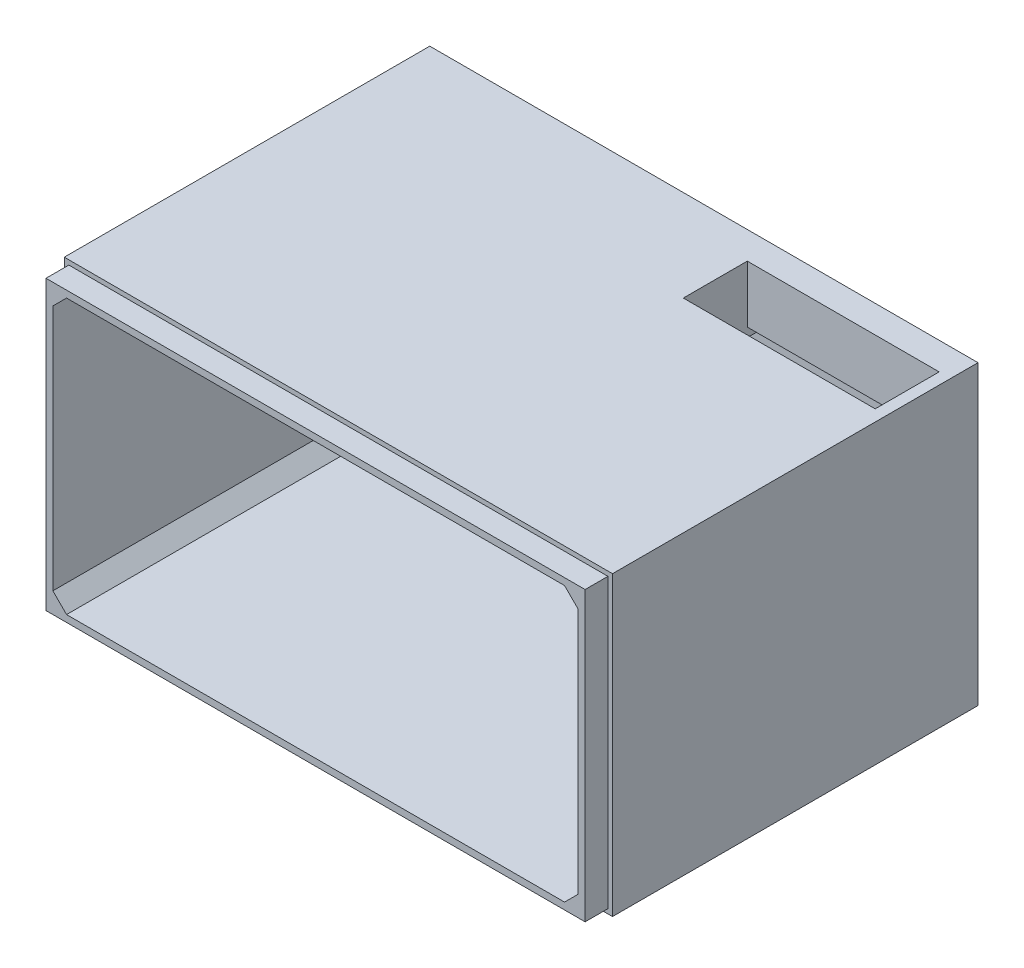
ISO-10303-21;
HEADER;
FILE_DESCRIPTION(('STEP AP214'),'2;1');
FILE_NAME('part.step','',(''),(''),'','','');
FILE_SCHEMA(('AUTOMOTIVE_DESIGN { 1 0 10303 214 1 1 1 1 }'));
ENDSEC;
DATA;
#1=APPLICATION_CONTEXT('core data for automotive mechanical design processes');
#2=APPLICATION_PROTOCOL_DEFINITION('international standard','automotive_design',2000,#1);
#3=PRODUCT_CONTEXT('',#1,'mechanical');
#4=PRODUCT('Part','Part','',(#3));
#5=PRODUCT_RELATED_PRODUCT_CATEGORY('part','',(#4));
#6=PRODUCT_DEFINITION_FORMATION('','',#4);
#7=PRODUCT_DEFINITION_CONTEXT('part definition',#1,'design');
#8=PRODUCT_DEFINITION('design','',#6,#7);
#9=PRODUCT_DEFINITION_SHAPE('','',#8);
#10=(LENGTH_UNIT() NAMED_UNIT(*) SI_UNIT(.MILLI.,.METRE.));
#11=(NAMED_UNIT(*) PLANE_ANGLE_UNIT() SI_UNIT($,.RADIAN.));
#12=(NAMED_UNIT(*) SI_UNIT($,.STERADIAN.) SOLID_ANGLE_UNIT());
#13=UNCERTAINTY_MEASURE_WITH_UNIT(LENGTH_MEASURE(1.E-05),#10,'distance_accuracy_value','');
#14=(GEOMETRIC_REPRESENTATION_CONTEXT(3) GLOBAL_UNCERTAINTY_ASSIGNED_CONTEXT((#13)) GLOBAL_UNIT_ASSIGNED_CONTEXT((#10,
#11,#12)) REPRESENTATION_CONTEXT('',''));
#15=CARTESIAN_POINT('',(0.,0.,0.));
#16=DIRECTION('',(0.,0.,1.));
#17=DIRECTION('',(1.,0.,0.));
#18=AXIS2_PLACEMENT_3D('',#15,#16,#17);
#19=CARTESIAN_POINT('',(73.5,50.5,14.));
#20=DIRECTION('',(0.,0.,1.));
#21=DIRECTION('',(1.,0.,0.));
#22=AXIS2_PLACEMENT_3D('',#19,#20,#21);
#23=PLANE('',#22);
#24=DIRECTION('',(1.,0.,0.));
#25=VECTOR('',#24,1.);
#26=CARTESIAN_POINT('',(73.5,50.5,14.));
#27=LINE('',#26,#25);
#28=CARTESIAN_POINT('',(115.112593264333,50.5,14.));
#29=VERTEX_POINT('',#28);
#30=CARTESIAN_POINT('',(117.5,50.5,14.));
#31=VERTEX_POINT('',#30);
#32=EDGE_CURVE('E248',#29,#31,#27,.T.);
#33=ORIENTED_EDGE('',*,*,#32,.F.);
#34=DIRECTION('',(0.,1.,0.));
#35=VECTOR('',#34,1.);
#36=CARTESIAN_POINT('',(115.112593264333,47.5,14.));
#37=LINE('',#36,#35);
#38=CARTESIAN_POINT('',(115.112593264333,52.5,14.));
#39=VERTEX_POINT('',#38);
#40=EDGE_CURVE('E233',#29,#39,#37,.T.);
#41=ORIENTED_EDGE('',*,*,#40,.T.);
#42=DIRECTION('',(1.,0.,0.));
#43=VECTOR('',#42,1.);
#44=CARTESIAN_POINT('',(73.5,52.5,14.));
#45=LINE('',#44,#43);
#46=CARTESIAN_POINT('',(117.5,52.5,14.));
#47=VERTEX_POINT('',#46);
#48=EDGE_CURVE('E246',#39,#47,#45,.T.);
#49=ORIENTED_EDGE('',*,*,#48,.T.);
#50=DIRECTION('',(0.,-1.,0.));
#51=VECTOR('',#50,1.);
#52=CARTESIAN_POINT('',(117.5,62.5,14.));
#53=LINE('',#52,#51);
#54=EDGE_CURVE('E268',#47,#31,#53,.T.);
#55=ORIENTED_EDGE('',*,*,#54,.T.);
#56=EDGE_LOOP('',(#33,#41,#49,#55));
#57=FACE_BOUND('',#56,.T.);
#58=ADVANCED_FACE('F32',(#57),#23,.F.);
#59=CARTESIAN_POINT('',(75.5,52.5,2.00000000000001));
#60=DIRECTION('',(0.,-1.,0.));
#61=DIRECTION('',(0.,0.,-1.));
#62=AXIS2_PLACEMENT_3D('',#59,#60,#61);
#63=PLANE('',#62);
#64=DIRECTION('',(1.,0.,0.));
#65=VECTOR('',#64,1.);
#66=CARTESIAN_POINT('',(75.5,52.5,6.00000000000002));
#67=LINE('',#66,#65);
#68=CARTESIAN_POINT('',(75.5,52.5,6.00000000000002));
#69=VERTEX_POINT('',#68);
#70=CARTESIAN_POINT('',(117.5,52.5,6.00000000000002));
#71=VERTEX_POINT('',#70);
#72=EDGE_CURVE('E285',#69,#71,#67,.T.);
#73=ORIENTED_EDGE('',*,*,#72,.F.);
#74=DIRECTION('',(0.,0.,-1.));
#75=VECTOR('',#74,1.);
#76=CARTESIAN_POINT('',(75.5,52.5,15.));
#77=LINE('',#76,#75);
#78=CARTESIAN_POINT('',(75.5,52.5,3.00000000000002));
#79=VERTEX_POINT('',#78);
#80=EDGE_CURVE('E448',#69,#79,#77,.T.);
#81=ORIENTED_EDGE('',*,*,#80,.T.);
#82=DIRECTION('',(1.,0.,0.));
#83=VECTOR('',#82,1.);
#84=CARTESIAN_POINT('',(0.,52.5,3.00000000000002));
#85=LINE('',#84,#83);
#86=CARTESIAN_POINT('',(117.5,52.5,3.00000000000002));
#87=VERTEX_POINT('',#86);
#88=EDGE_CURVE('E427',#79,#87,#85,.T.);
#89=ORIENTED_EDGE('',*,*,#88,.T.);
#90=DIRECTION('',(0.,0.,-1.));
#91=VECTOR('',#90,1.);
#92=CARTESIAN_POINT('',(117.5,52.5,3.00000000000002));
#93=LINE('',#92,#91);
#94=EDGE_CURVE('E288',#71,#87,#93,.T.);
#95=ORIENTED_EDGE('',*,*,#94,.F.);
#96=EDGE_LOOP('',(#73,#81,#89,#95));
#97=FACE_BOUND('',#96,.T.);
#98=ADVANCED_FACE('F496',(#97),#63,.T.);
#99=CARTESIAN_POINT('',(0.,0.,3.00000000000002));
#100=DIRECTION('',(0.,0.,1.));
#101=DIRECTION('',(1.,0.,0.));
#102=AXIS2_PLACEMENT_3D('',#99,#100,#101);
#103=PLANE('',#102);
#104=DIRECTION('',(1.,0.,0.));
#105=VECTOR('',#104,1.);
#106=CARTESIAN_POINT('',(73.5,50.5,3.00000000000002));
#107=LINE('',#106,#105);
#108=CARTESIAN_POINT('',(73.5,50.5,3.00000000000002));
#109=VERTEX_POINT('',#108);
#110=CARTESIAN_POINT('',(75.5,50.5,3.00000000000002));
#111=VERTEX_POINT('',#110);
#112=EDGE_CURVE('E453',#109,#111,#107,.T.);
#113=ORIENTED_EDGE('',*,*,#112,.F.);
#114=DIRECTION('',(0.,-1.,0.));
#115=VECTOR('',#114,1.);
#116=CARTESIAN_POINT('',(73.5,52.5,3.00000000000002));
#117=LINE('',#116,#115);
#118=CARTESIAN_POINT('',(73.4999999999999,62.5,3.00000000000002));
#119=VERTEX_POINT('',#118);
#120=EDGE_CURVE('E55',#119,#109,#117,.T.);
#121=ORIENTED_EDGE('',*,*,#120,.F.);
#122=DIRECTION('',(-1.,0.,0.));
#123=VECTOR('',#122,1.);
#124=CARTESIAN_POINT('',(2.49999999999997,62.5,3.00000000000002));
#125=LINE('',#124,#123);
#126=CARTESIAN_POINT('',(5.49999999999997,62.5,3.00000000000002));
#127=VERTEX_POINT('',#126);
#128=EDGE_CURVE('E389',#119,#127,#125,.T.);
#129=ORIENTED_EDGE('',*,*,#128,.T.);
#130=DIRECTION('',(0.707106781186547,0.707106781186548,0.));
#131=VECTOR('',#130,1.);
#132=CARTESIAN_POINT('',(-28.5,28.5,3.00000000000002));
#133=LINE('',#132,#131);
#134=CARTESIAN_POINT('',(2.49999999999997,59.5,3.00000000000002));
#135=VERTEX_POINT('',#134);
#136=EDGE_CURVE('E418',#135,#127,#133,.T.);
#137=ORIENTED_EDGE('',*,*,#136,.F.);
#138=DIRECTION('',(0.,-1.,0.));
#139=VECTOR('',#138,1.);
#140=CARTESIAN_POINT('',(2.49999999999997,62.5,3.00000000000002));
#141=LINE('',#140,#139);
#142=CARTESIAN_POINT('',(2.49999999999997,5.5,3.00000000000002));
#143=VERTEX_POINT('',#142);
#144=EDGE_CURVE('E381',#135,#143,#141,.T.);
#145=ORIENTED_EDGE('',*,*,#144,.T.);
#146=DIRECTION('',(-0.707106781186549,0.707106781186547,0.));
#147=VECTOR('',#146,1.);
#148=CARTESIAN_POINT('',(3.99999999999998,3.99999999999999,3.00000000000002));
#149=LINE('',#148,#147);
#150=CARTESIAN_POINT('',(5.49999999999998,2.5,3.00000000000002));
#151=VERTEX_POINT('',#150);
#152=EDGE_CURVE('E424',#151,#143,#149,.T.);
#153=ORIENTED_EDGE('',*,*,#152,.F.);
#154=DIRECTION('',(1.,0.,0.));
#155=VECTOR('',#154,1.);
#156=CARTESIAN_POINT('',(2.49999999999998,2.5,3.00000000000002));
#157=LINE('',#156,#155);
#158=CARTESIAN_POINT('',(114.5,2.5,3.00000000000002));
#159=VERTEX_POINT('',#158);
#160=EDGE_CURVE('E383',#151,#159,#157,.T.);
#161=ORIENTED_EDGE('',*,*,#160,.T.);
#162=DIRECTION('',(-0.707106781186548,-0.707106781186547,0.));
#163=VECTOR('',#162,1.);
#164=CARTESIAN_POINT('',(55.9999999999999,-56.,3.00000000000002));
#165=LINE('',#164,#163);
#166=CARTESIAN_POINT('',(117.5,5.5,3.00000000000002));
#167=VERTEX_POINT('',#166);
#168=EDGE_CURVE('E421',#167,#159,#165,.T.);
#169=ORIENTED_EDGE('',*,*,#168,.F.);
#170=DIRECTION('',(0.,1.,0.));
#171=VECTOR('',#170,1.);
#172=CARTESIAN_POINT('',(117.5,62.5,3.00000000000002));
#173=LINE('',#172,#171);
#174=EDGE_CURVE('E386',#167,#87,#173,.T.);
#175=ORIENTED_EDGE('',*,*,#174,.T.);
#176=ORIENTED_EDGE('',*,*,#88,.F.);
#177=DIRECTION('',(0.,1.,0.));
#178=VECTOR('',#177,1.);
#179=CARTESIAN_POINT('',(75.5,52.5,3.00000000000002));
#180=LINE('',#179,#178);
#181=EDGE_CURVE('E450',#111,#79,#180,.T.);
#182=ORIENTED_EDGE('',*,*,#181,.F.);
#183=EDGE_LOOP('',(#113,#121,#129,#137,#145,#153,#161,#169,#175,#176,#182));
#184=FACE_BOUND('',#183,.T.);
#185=ADVANCED_FACE('F500',(#184),#103,.T.);
#186=CARTESIAN_POINT('',(75.5,52.5,14.));
#187=VERTEX_POINT('',#186);
#188=CARTESIAN_POINT('',(98.1125932643334,52.5,14.));
#189=VERTEX_POINT('',#188);
#190=EDGE_CURVE('E255',#187,#189,#45,.T.);
#191=ORIENTED_EDGE('',*,*,#190,.T.);
#192=DIRECTION('',(0.,1.,0.));
#193=VECTOR('',#192,1.);
#194=CARTESIAN_POINT('',(98.1125932643334,47.5,14.));
#195=LINE('',#194,#193);
#196=CARTESIAN_POINT('',(98.1125932643334,50.5,14.));
#197=VERTEX_POINT('',#196);
#198=EDGE_CURVE('E47',#197,#189,#195,.T.);
#199=ORIENTED_EDGE('',*,*,#198,.F.);
#200=CARTESIAN_POINT('',(75.5,50.5,14.));
#201=VERTEX_POINT('',#200);
#202=EDGE_CURVE('E440',#201,#197,#27,.T.);
#203=ORIENTED_EDGE('',*,*,#202,.F.);
#204=DIRECTION('',(0.,-1.,0.));
#205=VECTOR('',#204,1.);
#206=CARTESIAN_POINT('',(75.5,50.5,14.));
#207=LINE('',#206,#205);
#208=EDGE_CURVE('E256',#187,#201,#207,.T.);
#209=ORIENTED_EDGE('',*,*,#208,.F.);
#210=EDGE_LOOP('',(#191,#199,#203,#209));
#211=FACE_BOUND('',#210,.T.);
#212=ADVANCED_FACE('F474',(#211),#23,.F.);
#213=CARTESIAN_POINT('',(117.5,62.5,3.00000000000002));
#214=DIRECTION('',(1.,0.,0.));
#215=DIRECTION('',(0.,1.,0.));
#216=AXIS2_PLACEMENT_3D('',#213,#214,#215);
#217=PLANE('',#216);
#218=DIRECTION('',(0.,-1.,0.));
#219=VECTOR('',#218,1.);
#220=CARTESIAN_POINT('',(117.5,62.5,22.));
#221=LINE('',#220,#219);
#222=CARTESIAN_POINT('',(117.5,59.5,22.));
#223=VERTEX_POINT('',#222);
#224=CARTESIAN_POINT('',(117.5,50.5,22.));
#225=VERTEX_POINT('',#224);
#226=EDGE_CURVE('E40',#223,#225,#221,.T.);
#227=ORIENTED_EDGE('',*,*,#226,.T.);
#228=DIRECTION('',(0.,0.,-1.));
#229=VECTOR('',#228,1.);
#230=CARTESIAN_POINT('',(117.5,50.5,3.00000000000002));
#231=LINE('',#230,#229);
#232=EDGE_CURVE('E11',#225,#31,#231,.T.);
#233=ORIENTED_EDGE('',*,*,#232,.T.);
#234=ORIENTED_EDGE('',*,*,#54,.F.);
#235=DIRECTION('',(0.,0.,-1.));
#236=VECTOR('',#235,1.);
#237=CARTESIAN_POINT('',(117.5,52.5,3.00000000000002));
#238=LINE('',#237,#236);
#239=CARTESIAN_POINT('',(117.5,52.5,20.));
#240=VERTEX_POINT('',#239);
#241=EDGE_CURVE('E253',#240,#47,#238,.T.);
#242=ORIENTED_EDGE('',*,*,#241,.F.);
#243=DIRECTION('',(0.,1.,0.));
#244=VECTOR('',#243,1.);
#245=CARTESIAN_POINT('',(117.5,55.,20.));
#246=LINE('',#245,#244);
#247=CARTESIAN_POINT('',(117.5,65.,20.));
#248=VERTEX_POINT('',#247);
#249=EDGE_CURVE('E304',#240,#248,#246,.T.);
#250=ORIENTED_EDGE('',*,*,#249,.T.);
#251=DIRECTION('',(0.,0.,-1.));
#252=VECTOR('',#251,1.);
#253=CARTESIAN_POINT('',(117.5,65.,20.));
#254=LINE('',#253,#252);
#255=CARTESIAN_POINT('',(117.5,65.,6.));
#256=VERTEX_POINT('',#255);
#257=EDGE_CURVE('E291',#248,#256,#254,.T.);
#258=ORIENTED_EDGE('',*,*,#257,.T.);
#259=DIRECTION('',(0.,1.,0.));
#260=VECTOR('',#259,1.);
#261=CARTESIAN_POINT('',(117.5,55.,6.));
#262=LINE('',#261,#260);
#263=EDGE_CURVE('E303',#71,#256,#262,.T.);
#264=ORIENTED_EDGE('',*,*,#263,.F.);
#265=ORIENTED_EDGE('',*,*,#94,.T.);
#266=ORIENTED_EDGE('',*,*,#174,.F.);
#267=DIRECTION('',(0.,0.,1.));
#268=VECTOR('',#267,1.);
#269=CARTESIAN_POINT('',(117.5,5.5,0.));
#270=LINE('',#269,#268);
#271=CARTESIAN_POINT('',(117.5,5.5,85.));
#272=VERTEX_POINT('',#271);
#273=EDGE_CURVE('E338',#167,#272,#270,.T.);
#274=ORIENTED_EDGE('',*,*,#273,.T.);
#275=DIRECTION('',(0.,1.,0.));
#276=VECTOR('',#275,1.);
#277=CARTESIAN_POINT('',(117.5,62.5,85.));
#278=LINE('',#277,#276);
#279=CARTESIAN_POINT('',(117.5,59.5,85.));
#280=VERTEX_POINT('',#279);
#281=EDGE_CURVE('E395',#272,#280,#278,.T.);
#282=ORIENTED_EDGE('',*,*,#281,.T.);
#283=DIRECTION('',(0.,0.,1.));
#284=VECTOR('',#283,1.);
#285=CARTESIAN_POINT('',(117.5,59.5,0.));
#286=LINE('',#285,#284);
#287=EDGE_CURVE('E346',#223,#280,#286,.T.);
#288=ORIENTED_EDGE('',*,*,#287,.F.);
#289=EDGE_LOOP('',(#227,#233,#234,#242,#250,#258,#264,#265,#266,#274,#282,#288));
#290=FACE_BOUND('',#289,.T.);
#291=ADVANCED_FACE('F432',(#290),#217,.F.);
#292=CARTESIAN_POINT('',(2.49999999999997,62.5,3.00000000000002));
#293=DIRECTION('',(0.,1.,0.));
#294=DIRECTION('',(0.,0.,1.));
#295=AXIS2_PLACEMENT_3D('',#292,#293,#294);
#296=PLANE('',#295);
#297=DIRECTION('',(0.,0.,-1.));
#298=VECTOR('',#297,1.);
#299=CARTESIAN_POINT('',(73.5,62.5,20.));
#300=LINE('',#299,#298);
#301=CARTESIAN_POINT('',(73.5,62.5,22.));
#302=VERTEX_POINT('',#301);
#303=EDGE_CURVE('E283',#302,#119,#300,.T.);
#304=ORIENTED_EDGE('',*,*,#303,.F.);
#305=DIRECTION('',(-1.,0.,0.));
#306=VECTOR('',#305,1.);
#307=CARTESIAN_POINT('',(73.5,62.5,22.));
#308=LINE('',#307,#306);
#309=CARTESIAN_POINT('',(114.5,62.5,22.));
#310=VERTEX_POINT('',#309);
#311=EDGE_CURVE('E273',#310,#302,#308,.T.);
#312=ORIENTED_EDGE('',*,*,#311,.F.);
#313=DIRECTION('',(0.,0.,1.));
#314=VECTOR('',#313,1.);
#315=CARTESIAN_POINT('',(114.5,62.5,0.));
#316=LINE('',#315,#314);
#317=CARTESIAN_POINT('',(114.5,62.5,85.));
#318=VERTEX_POINT('',#317);
#319=EDGE_CURVE('E345',#310,#318,#316,.T.);
#320=ORIENTED_EDGE('',*,*,#319,.T.);
#321=DIRECTION('',(-1.,0.,0.));
#322=VECTOR('',#321,1.);
#323=CARTESIAN_POINT('',(2.49999999999997,62.5,85.));
#324=LINE('',#323,#322);
#325=CARTESIAN_POINT('',(5.49999999999997,62.5,85.));
#326=VERTEX_POINT('',#325);
#327=EDGE_CURVE('E384',#318,#326,#324,.T.);
#328=ORIENTED_EDGE('',*,*,#327,.T.);
#329=DIRECTION('',(0.,0.,1.));
#330=VECTOR('',#329,1.);
#331=CARTESIAN_POINT('',(5.49999999999997,62.5,0.));
#332=LINE('',#331,#330);
#333=EDGE_CURVE('E353',#127,#326,#332,.T.);
#334=ORIENTED_EDGE('',*,*,#333,.F.);
#335=ORIENTED_EDGE('',*,*,#128,.F.);
#336=EDGE_LOOP('',(#304,#312,#320,#328,#334,#335));
#337=FACE_BOUND('',#336,.T.);
#338=ADVANCED_FACE('F521',(#337),#296,.F.);
#339=CARTESIAN_POINT('',(114.5,62.5,0.));
#340=DIRECTION('',(-0.707106781186548,-0.707106781186548,0.));
#341=DIRECTION('',(0.707106781186548,-0.707106781186548,0.));
#342=AXIS2_PLACEMENT_3D('',#339,#340,#341);
#343=PLANE('',#342);
#344=DIRECTION('',(-0.707106781186548,0.707106781186548,0.));
#345=VECTOR('',#344,1.);
#346=CARTESIAN_POINT('',(114.5,62.5,22.));
#347=LINE('',#346,#345);
#348=EDGE_CURVE('E276',#223,#310,#347,.T.);
#349=ORIENTED_EDGE('',*,*,#348,.F.);
#350=ORIENTED_EDGE('',*,*,#287,.T.);
#351=DIRECTION('',(0.707106781186547,-0.707106781186547,0.));
#352=VECTOR('',#351,1.);
#353=CARTESIAN_POINT('',(114.5,62.5,85.));
#354=LINE('',#353,#352);
#355=EDGE_CURVE('E340',#318,#280,#354,.T.);
#356=ORIENTED_EDGE('',*,*,#355,.F.);
#357=ORIENTED_EDGE('',*,*,#319,.F.);
#358=EDGE_LOOP('',(#349,#350,#356,#357));
#359=FACE_BOUND('',#358,.T.);
#360=ADVANCED_FACE('F517',(#359),#343,.T.);
#361=CARTESIAN_POINT('',(0.,0.,85.));
#362=DIRECTION('',(0.,0.,-1.));
#363=DIRECTION('',(-1.,0.,0.));
#364=AXIS2_PLACEMENT_3D('',#361,#362,#363);
#365=PLANE('',#364);
#366=ORIENTED_EDGE('',*,*,#281,.F.);
#367=DIRECTION('',(-0.707106781186548,-0.707106781186547,0.));
#368=VECTOR('',#367,1.);
#369=CARTESIAN_POINT('',(114.5,2.5,85.));
#370=LINE('',#369,#368);
#371=CARTESIAN_POINT('',(114.5,2.5,85.));
#372=VERTEX_POINT('',#371);
#373=EDGE_CURVE('E333',#272,#372,#370,.T.);
#374=ORIENTED_EDGE('',*,*,#373,.T.);
#375=DIRECTION('',(1.,0.,0.));
#376=VECTOR('',#375,1.);
#377=CARTESIAN_POINT('',(2.49999999999998,2.5,85.));
#378=LINE('',#377,#376);
#379=CARTESIAN_POINT('',(5.49999999999998,2.5,85.));
#380=VERTEX_POINT('',#379);
#381=EDGE_CURVE('E393',#380,#372,#378,.T.);
#382=ORIENTED_EDGE('',*,*,#381,.F.);
#383=DIRECTION('',(-0.707106781186548,0.707106781186546,0.));
#384=VECTOR('',#383,1.);
#385=CARTESIAN_POINT('',(2.49999999999997,5.5,85.));
#386=LINE('',#385,#384);
#387=CARTESIAN_POINT('',(2.49999999999998,5.5,85.));
#388=VERTEX_POINT('',#387);
#389=EDGE_CURVE('E326',#380,#388,#386,.T.);
#390=ORIENTED_EDGE('',*,*,#389,.T.);
#391=DIRECTION('',(0.,-1.,0.));
#392=VECTOR('',#391,1.);
#393=CARTESIAN_POINT('',(2.49999999999997,62.5,85.));
#394=LINE('',#393,#392);
#395=CARTESIAN_POINT('',(2.49999999999997,59.5,85.));
#396=VERTEX_POINT('',#395);
#397=EDGE_CURVE('E379',#396,#388,#394,.T.);
#398=ORIENTED_EDGE('',*,*,#397,.F.);
#399=DIRECTION('',(0.707106781186547,0.707106781186548,0.));
#400=VECTOR('',#399,1.);
#401=CARTESIAN_POINT('',(2.49999999999997,59.5,85.));
#402=LINE('',#401,#400);
#403=EDGE_CURVE('E348',#396,#326,#402,.T.);
#404=ORIENTED_EDGE('',*,*,#403,.T.);
#405=ORIENTED_EDGE('',*,*,#327,.F.);
#406=ORIENTED_EDGE('',*,*,#355,.T.);
#407=EDGE_LOOP('',(#366,#374,#382,#390,#398,#404,#405,#406));
#408=FACE_BOUND('',#407,.T.);
#409=DIRECTION('',(-1.,0.,0.));
#410=VECTOR('',#409,1.);
#411=CARTESIAN_POINT('',(119.,1.,85.));
#412=LINE('',#411,#410);
#413=CARTESIAN_POINT('',(119.,1.,85.));
#414=VERTEX_POINT('',#413);
#415=CARTESIAN_POINT('',(0.999999999999986,1.,85.));
#416=VERTEX_POINT('',#415);
#417=EDGE_CURVE('E313',#414,#416,#412,.T.);
#418=ORIENTED_EDGE('',*,*,#417,.F.);
#419=DIRECTION('',(0.,-1.,0.));
#420=VECTOR('',#419,1.);
#421=CARTESIAN_POINT('',(119.,64.,85.));
#422=LINE('',#421,#420);
#423=CARTESIAN_POINT('',(119.,64.,85.));
#424=VERTEX_POINT('',#423);
#425=EDGE_CURVE('E319',#424,#414,#422,.T.);
#426=ORIENTED_EDGE('',*,*,#425,.F.);
#427=DIRECTION('',(1.,0.,0.));
#428=VECTOR('',#427,1.);
#429=CARTESIAN_POINT('',(0.999999999999972,64.,85.));
#430=LINE('',#429,#428);
#431=CARTESIAN_POINT('',(0.999999999999972,64.,85.));
#432=VERTEX_POINT('',#431);
#433=EDGE_CURVE('E360',#432,#424,#430,.T.);
#434=ORIENTED_EDGE('',*,*,#433,.F.);
#435=DIRECTION('',(0.,1.,0.));
#436=VECTOR('',#435,1.);
#437=CARTESIAN_POINT('',(0.999999999999972,65.,85.));
#438=LINE('',#437,#436);
#439=EDGE_CURVE('E369',#416,#432,#438,.T.);
#440=ORIENTED_EDGE('',*,*,#439,.F.);
#441=EDGE_LOOP('',(#418,#426,#434,#440));
#442=FACE_BOUND('',#441,.T.);
#443=ADVANCED_FACE('F510',(#408,#442),#365,.F.);
#444=CARTESIAN_POINT('',(1.,0.,0.));
#445=DIRECTION('',(1.,0.,0.));
#446=DIRECTION('',(0.,1.,0.));
#447=AXIS2_PLACEMENT_3D('',#444,#445,#446);
#448=PLANE('',#447);
#449=DIRECTION('',(0.,0.,-1.));
#450=VECTOR('',#449,1.);
#451=CARTESIAN_POINT('',(0.999999999999986,1.,80.));
#452=LINE('',#451,#450);
#453=CARTESIAN_POINT('',(0.999999999999986,1.,80.));
#454=VERTEX_POINT('',#453);
#455=EDGE_CURVE('E315',#416,#454,#452,.T.);
#456=ORIENTED_EDGE('',*,*,#455,.F.);
#457=ORIENTED_EDGE('',*,*,#439,.T.);
#458=DIRECTION('',(0.,0.,1.));
#459=VECTOR('',#458,1.);
#460=CARTESIAN_POINT('',(0.999999999999972,64.,85.));
#461=LINE('',#460,#459);
#462=CARTESIAN_POINT('',(0.999999999999973,64.,80.));
#463=VERTEX_POINT('',#462);
#464=EDGE_CURVE('E356',#463,#432,#461,.T.);
#465=ORIENTED_EDGE('',*,*,#464,.F.);
#466=DIRECTION('',(0.,-1.,0.));
#467=VECTOR('',#466,1.);
#468=CARTESIAN_POINT('',(0.999999999999972,65.,80.));
#469=LINE('',#468,#467);
#470=EDGE_CURVE('E371',#463,#454,#469,.T.);
#471=ORIENTED_EDGE('',*,*,#470,.T.);
#472=EDGE_LOOP('',(#456,#457,#465,#471));
#473=FACE_BOUND('',#472,.T.);
#474=ADVANCED_FACE('F580',(#473),#448,.F.);
#475=CARTESIAN_POINT('',(119.,0.,0.));
#476=DIRECTION('',(1.,0.,0.));
#477=DIRECTION('',(0.,1.,0.));
#478=AXIS2_PLACEMENT_3D('',#475,#476,#477);
#479=PLANE('',#478);
#480=ORIENTED_EDGE('',*,*,#425,.T.);
#481=DIRECTION('',(0.,0.,1.));
#482=VECTOR('',#481,1.);
#483=CARTESIAN_POINT('',(119.,1.,80.));
#484=LINE('',#483,#482);
#485=CARTESIAN_POINT('',(119.,1.,80.));
#486=VERTEX_POINT('',#485);
#487=EDGE_CURVE('E306',#486,#414,#484,.T.);
#488=ORIENTED_EDGE('',*,*,#487,.F.);
#489=DIRECTION('',(0.,1.,0.));
#490=VECTOR('',#489,1.);
#491=CARTESIAN_POINT('',(119.,64.,80.));
#492=LINE('',#491,#490);
#493=CARTESIAN_POINT('',(119.,64.,80.));
#494=VERTEX_POINT('',#493);
#495=EDGE_CURVE('E322',#486,#494,#492,.T.);
#496=ORIENTED_EDGE('',*,*,#495,.T.);
#497=DIRECTION('',(0.,0.,1.));
#498=VECTOR('',#497,1.);
#499=CARTESIAN_POINT('',(119.,64.,85.));
#500=LINE('',#499,#498);
#501=EDGE_CURVE('E324',#494,#424,#500,.T.);
#502=ORIENTED_EDGE('',*,*,#501,.T.);
#503=EDGE_LOOP('',(#480,#488,#496,#502));
#504=FACE_BOUND('',#503,.T.);
#505=ADVANCED_FACE('F589',(#504),#479,.T.);
#506=CARTESIAN_POINT('',(0.,64.,0.));
#507=DIRECTION('',(0.,-1.,0.));
#508=DIRECTION('',(0.,0.,-1.));
#509=AXIS2_PLACEMENT_3D('',#506,#507,#508);
#510=PLANE('',#509);
#511=ORIENTED_EDGE('',*,*,#501,.F.);
#512=DIRECTION('',(-1.,0.,0.));
#513=VECTOR('',#512,1.);
#514=CARTESIAN_POINT('',(0.999999999999972,64.,80.));
#515=LINE('',#514,#513);
#516=EDGE_CURVE('E363',#494,#463,#515,.T.);
#517=ORIENTED_EDGE('',*,*,#516,.T.);
#518=ORIENTED_EDGE('',*,*,#464,.T.);
#519=ORIENTED_EDGE('',*,*,#433,.T.);
#520=EDGE_LOOP('',(#511,#517,#518,#519));
#521=FACE_BOUND('',#520,.T.);
#522=ADVANCED_FACE('F587',(#521),#510,.F.);
#523=CARTESIAN_POINT('',(0.,0.,85.));
#524=DIRECTION('',(1.,0.,0.));
#525=DIRECTION('',(0.,1.,0.));
#526=AXIS2_PLACEMENT_3D('',#523,#524,#525);
#527=PLANE('',#526);
#528=DIRECTION('',(0.,0.,-1.));
#529=VECTOR('',#528,1.);
#530=CARTESIAN_POINT('',(0.,0.,85.));
#531=LINE('',#530,#529);
#532=CARTESIAN_POINT('',(0.,0.,80.));
#533=VERTEX_POINT('',#532);
#534=CARTESIAN_POINT('',(0.,0.,0.));
#535=VERTEX_POINT('',#534);
#536=EDGE_CURVE('E416',#533,#535,#531,.T.);
#537=ORIENTED_EDGE('',*,*,#536,.F.);
#538=DIRECTION('',(0.,-1.,0.));
#539=VECTOR('',#538,1.);
#540=CARTESIAN_POINT('',(0.,65.,80.));
#541=LINE('',#540,#539);
#542=CARTESIAN_POINT('',(0.,65.,80.));
#543=VERTEX_POINT('',#542);
#544=EDGE_CURVE('E368',#543,#533,#541,.T.);
#545=ORIENTED_EDGE('',*,*,#544,.F.);
#546=DIRECTION('',(0.,0.,-1.));
#547=VECTOR('',#546,1.);
#548=CARTESIAN_POINT('',(0.,65.,85.));
#549=LINE('',#548,#547);
#550=CARTESIAN_POINT('',(0.,65.,0.));
#551=VERTEX_POINT('',#550);
#552=EDGE_CURVE('E410',#543,#551,#549,.T.);
#553=ORIENTED_EDGE('',*,*,#552,.T.);
#554=DIRECTION('',(0.,-1.,0.));
#555=VECTOR('',#554,1.);
#556=CARTESIAN_POINT('',(0.,0.,0.));
#557=LINE('',#556,#555);
#558=EDGE_CURVE('E391',#551,#535,#557,.T.);
#559=ORIENTED_EDGE('',*,*,#558,.T.);
#560=EDGE_LOOP('',(#537,#545,#553,#559));
#561=FACE_BOUND('',#560,.T.);
#562=ADVANCED_FACE('F34',(#561),#527,.F.);
#563=CARTESIAN_POINT('',(0.,0.,85.));
#564=DIRECTION('',(0.,1.,0.));
#565=DIRECTION('',(0.,0.,1.));
#566=AXIS2_PLACEMENT_3D('',#563,#564,#565);
#567=PLANE('',#566);
#568=DIRECTION('',(0.,0.,-1.));
#569=VECTOR('',#568,1.);
#570=CARTESIAN_POINT('',(120.,0.,85.));
#571=LINE('',#570,#569);
#572=CARTESIAN_POINT('',(120.,0.,80.));
#573=VERTEX_POINT('',#572);
#574=CARTESIAN_POINT('',(120.,0.,0.));
#575=VERTEX_POINT('',#574);
#576=EDGE_CURVE('E414',#573,#575,#571,.T.);
#577=ORIENTED_EDGE('',*,*,#576,.F.);
#578=DIRECTION('',(-1.,0.,0.));
#579=VECTOR('',#578,1.);
#580=CARTESIAN_POINT('',(1.,0.,80.));
#581=LINE('',#580,#579);
#582=EDGE_CURVE('E376',#573,#533,#581,.T.);
#583=ORIENTED_EDGE('',*,*,#582,.T.);
#584=ORIENTED_EDGE('',*,*,#536,.T.);
#585=DIRECTION('',(1.,0.,0.));
#586=VECTOR('',#585,1.);
#587=CARTESIAN_POINT('',(0.,0.,0.));
#588=LINE('',#587,#586);
#589=EDGE_CURVE('E401',#535,#575,#588,.T.);
#590=ORIENTED_EDGE('',*,*,#589,.T.);
#591=EDGE_LOOP('',(#577,#583,#584,#590));
#592=FACE_BOUND('',#591,.T.);
#593=ADVANCED_FACE('F803',(#592),#567,.F.);
#594=CARTESIAN_POINT('',(120.,0.,85.));
#595=DIRECTION('',(-1.,0.,0.));
#596=DIRECTION('',(0.,-1.,0.));
#597=AXIS2_PLACEMENT_3D('',#594,#595,#596);
#598=PLANE('',#597);
#599=DIRECTION('',(0.,1.,0.));
#600=VECTOR('',#599,1.);
#601=CARTESIAN_POINT('',(120.,64.,80.));
#602=LINE('',#601,#600);
#603=CARTESIAN_POINT('',(120.,65.,80.));
#604=VERTEX_POINT('',#603);
#605=EDGE_CURVE('E365',#573,#604,#602,.T.);
#606=ORIENTED_EDGE('',*,*,#605,.F.);
#607=ORIENTED_EDGE('',*,*,#576,.T.);
#608=DIRECTION('',(0.,1.,0.));
#609=VECTOR('',#608,1.);
#610=CARTESIAN_POINT('',(120.,0.,0.));
#611=LINE('',#610,#609);
#612=CARTESIAN_POINT('',(120.,65.,0.));
#613=VERTEX_POINT('',#612);
#614=EDGE_CURVE('E404',#575,#613,#611,.T.);
#615=ORIENTED_EDGE('',*,*,#614,.T.);
#616=DIRECTION('',(0.,0.,-1.));
#617=VECTOR('',#616,1.);
#618=CARTESIAN_POINT('',(120.,65.,85.));
#619=LINE('',#618,#617);
#620=EDGE_CURVE('E412',#604,#613,#619,.T.);
#621=ORIENTED_EDGE('',*,*,#620,.F.);
#622=EDGE_LOOP('',(#606,#607,#615,#621));
#623=FACE_BOUND('',#622,.T.);
#624=ADVANCED_FACE('F788',(#623),#598,.F.);
#625=CARTESIAN_POINT('',(0.,65.,85.));
#626=DIRECTION('',(0.,-1.,0.));
#627=DIRECTION('',(0.,0.,-1.));
#628=AXIS2_PLACEMENT_3D('',#625,#626,#627);
#629=PLANE('',#628);
#630=DIRECTION('',(-1.,0.,0.));
#631=VECTOR('',#630,1.);
#632=CARTESIAN_POINT('',(117.5,65.,6.));
#633=LINE('',#632,#631);
#634=CARTESIAN_POINT('',(75.5,65.,6.00000000000001));
#635=VERTEX_POINT('',#634);
#636=EDGE_CURVE('E294',#256,#635,#633,.T.);
#637=ORIENTED_EDGE('',*,*,#636,.F.);
#638=ORIENTED_EDGE('',*,*,#257,.F.);
#639=DIRECTION('',(1.,0.,0.));
#640=VECTOR('',#639,1.);
#641=CARTESIAN_POINT('',(117.5,65.,20.));
#642=LINE('',#641,#640);
#643=CARTESIAN_POINT('',(75.5,65.,20.));
#644=VERTEX_POINT('',#643);
#645=EDGE_CURVE('E300',#644,#248,#642,.T.);
#646=ORIENTED_EDGE('',*,*,#645,.F.);
#647=DIRECTION('',(0.,0.,1.));
#648=VECTOR('',#647,1.);
#649=CARTESIAN_POINT('',(75.5,65.,20.));
#650=LINE('',#649,#648);
#651=EDGE_CURVE('E297',#635,#644,#650,.T.);
#652=ORIENTED_EDGE('',*,*,#651,.F.);
#653=EDGE_LOOP('',(#637,#638,#646,#652));
#654=FACE_BOUND('',#653,.T.);
#655=DIRECTION('',(-1.,0.,0.));
#656=VECTOR('',#655,1.);
#657=CARTESIAN_POINT('',(0.999999999999972,65.,80.));
#658=LINE('',#657,#656);
#659=EDGE_CURVE('E374',#604,#543,#658,.T.);
#660=ORIENTED_EDGE('',*,*,#659,.F.);
#661=ORIENTED_EDGE('',*,*,#620,.T.);
#662=DIRECTION('',(-1.,0.,0.));
#663=VECTOR('',#662,1.);
#664=CARTESIAN_POINT('',(0.,65.,0.));
#665=LINE('',#664,#663);
#666=EDGE_CURVE('E407',#613,#551,#665,.T.);
#667=ORIENTED_EDGE('',*,*,#666,.T.);
#668=ORIENTED_EDGE('',*,*,#552,.F.);
#669=EDGE_LOOP('',(#660,#661,#667,#668));
#670=FACE_BOUND('',#669,.T.);
#671=ADVANCED_FACE('F489',(#654,#670),#629,.F.);
#672=CARTESIAN_POINT('',(0.,0.,0.));
#673=DIRECTION('',(0.,0.,-1.));
#674=DIRECTION('',(-1.,0.,0.));
#675=AXIS2_PLACEMENT_3D('',#672,#673,#674);
#676=PLANE('',#675);
#677=ORIENTED_EDGE('',*,*,#558,.F.);
#678=ORIENTED_EDGE('',*,*,#666,.F.);
#679=ORIENTED_EDGE('',*,*,#614,.F.);
#680=ORIENTED_EDGE('',*,*,#589,.F.);
#681=EDGE_LOOP('',(#677,#678,#679,#680));
#682=FACE_BOUND('',#681,.T.);
#683=ADVANCED_FACE('F547',(#682),#676,.T.);
#684=CARTESIAN_POINT('',(2.49999999999997,62.5,3.00000000000002));
#685=DIRECTION('',(-1.,0.,0.));
#686=DIRECTION('',(0.,-1.,0.));
#687=AXIS2_PLACEMENT_3D('',#684,#685,#686);
#688=PLANE('',#687);
#689=ORIENTED_EDGE('',*,*,#397,.T.);
#690=DIRECTION('',(0.,0.,1.));
#691=VECTOR('',#690,1.);
#692=CARTESIAN_POINT('',(2.49999999999997,5.5,0.));
#693=LINE('',#692,#691);
#694=EDGE_CURVE('E330',#143,#388,#693,.T.);
#695=ORIENTED_EDGE('',*,*,#694,.F.);
#696=ORIENTED_EDGE('',*,*,#144,.F.);
#697=DIRECTION('',(0.,0.,1.));
#698=VECTOR('',#697,1.);
#699=CARTESIAN_POINT('',(2.49999999999997,59.5,0.));
#700=LINE('',#699,#698);
#701=EDGE_CURVE('E352',#135,#396,#700,.T.);
#702=ORIENTED_EDGE('',*,*,#701,.T.);
#703=EDGE_LOOP('',(#689,#695,#696,#702));
#704=FACE_BOUND('',#703,.T.);
#705=ADVANCED_FACE('F528',(#704),#688,.F.);
#706=CARTESIAN_POINT('',(2.49999999999998,2.5,3.00000000000002));
#707=DIRECTION('',(0.,-1.,0.));
#708=DIRECTION('',(0.,0.,-1.));
#709=AXIS2_PLACEMENT_3D('',#706,#707,#708);
#710=PLANE('',#709);
#711=ORIENTED_EDGE('',*,*,#160,.F.);
#712=DIRECTION('',(0.,0.,1.));
#713=VECTOR('',#712,1.);
#714=CARTESIAN_POINT('',(5.49999999999998,2.5,0.));
#715=LINE('',#714,#713);
#716=EDGE_CURVE('E329',#151,#380,#715,.T.);
#717=ORIENTED_EDGE('',*,*,#716,.T.);
#718=ORIENTED_EDGE('',*,*,#381,.T.);
#719=DIRECTION('',(0.,0.,1.));
#720=VECTOR('',#719,1.);
#721=CARTESIAN_POINT('',(114.5,2.5,0.));
#722=LINE('',#721,#720);
#723=EDGE_CURVE('E337',#159,#372,#722,.T.);
#724=ORIENTED_EDGE('',*,*,#723,.F.);
#725=EDGE_LOOP('',(#711,#717,#718,#724));
#726=FACE_BOUND('',#725,.T.);
#727=ADVANCED_FACE('F537',(#726),#710,.F.);
#728=CARTESIAN_POINT('',(0.999999999999972,65.,80.));
#729=DIRECTION('',(0.,0.,-1.));
#730=DIRECTION('',(0.,1.,0.));
#731=AXIS2_PLACEMENT_3D('',#728,#729,#730);
#732=PLANE('',#731);
#733=ORIENTED_EDGE('',*,*,#582,.F.);
#734=ORIENTED_EDGE('',*,*,#605,.T.);
#735=ORIENTED_EDGE('',*,*,#659,.T.);
#736=ORIENTED_EDGE('',*,*,#544,.T.);
#737=EDGE_LOOP('',(#733,#734,#735,#736));
#738=FACE_BOUND('',#737,.T.);
#739=DIRECTION('',(1.,0.,0.));
#740=VECTOR('',#739,1.);
#741=CARTESIAN_POINT('',(119.,1.,80.));
#742=LINE('',#741,#740);
#743=EDGE_CURVE('E317',#454,#486,#742,.T.);
#744=ORIENTED_EDGE('',*,*,#743,.F.);
#745=ORIENTED_EDGE('',*,*,#470,.F.);
#746=ORIENTED_EDGE('',*,*,#516,.F.);
#747=ORIENTED_EDGE('',*,*,#495,.F.);
#748=EDGE_LOOP('',(#744,#745,#746,#747));
#749=FACE_BOUND('',#748,.T.);
#750=ADVANCED_FACE('F539',(#738,#749),#732,.F.);
#751=CARTESIAN_POINT('',(2.49999999999997,59.5,0.));
#752=DIRECTION('',(0.707106781186548,-0.707106781186547,0.));
#753=DIRECTION('',(0.707106781186547,0.707106781186548,0.));
#754=AXIS2_PLACEMENT_3D('',#751,#752,#753);
#755=PLANE('',#754);
#756=ORIENTED_EDGE('',*,*,#701,.F.);
#757=ORIENTED_EDGE('',*,*,#136,.T.);
#758=ORIENTED_EDGE('',*,*,#333,.T.);
#759=ORIENTED_EDGE('',*,*,#403,.F.);
#760=EDGE_LOOP('',(#756,#757,#758,#759));
#761=FACE_BOUND('',#760,.T.);
#762=ADVANCED_FACE('F531',(#761),#755,.T.);
#763=CARTESIAN_POINT('',(114.5,2.5,0.));
#764=DIRECTION('',(-0.707106781186547,0.707106781186548,0.));
#765=DIRECTION('',(-0.707106781186548,-0.707106781186547,0.));
#766=AXIS2_PLACEMENT_3D('',#763,#764,#765);
#767=PLANE('',#766);
#768=ORIENTED_EDGE('',*,*,#273,.F.);
#769=ORIENTED_EDGE('',*,*,#168,.T.);
#770=ORIENTED_EDGE('',*,*,#723,.T.);
#771=ORIENTED_EDGE('',*,*,#373,.F.);
#772=EDGE_LOOP('',(#768,#769,#770,#771));
#773=FACE_BOUND('',#772,.T.);
#774=ADVANCED_FACE('F506',(#773),#767,.T.);
#775=CARTESIAN_POINT('',(2.49999999999997,5.5,0.));
#776=DIRECTION('',(0.707106781186547,0.707106781186549,0.));
#777=DIRECTION('',(-0.707106781186549,0.707106781186547,0.));
#778=AXIS2_PLACEMENT_3D('',#775,#776,#777);
#779=PLANE('',#778);
#780=ORIENTED_EDGE('',*,*,#716,.F.);
#781=ORIENTED_EDGE('',*,*,#152,.T.);
#782=ORIENTED_EDGE('',*,*,#694,.T.);
#783=ORIENTED_EDGE('',*,*,#389,.F.);
#784=EDGE_LOOP('',(#780,#781,#782,#783));
#785=FACE_BOUND('',#784,.T.);
#786=ADVANCED_FACE('F534',(#785),#779,.T.);
#787=CARTESIAN_POINT('',(0.,1.,0.));
#788=DIRECTION('',(0.,-1.,0.));
#789=DIRECTION('',(0.,0.,-1.));
#790=AXIS2_PLACEMENT_3D('',#787,#788,#789);
#791=PLANE('',#790);
#792=ORIENTED_EDGE('',*,*,#487,.T.);
#793=ORIENTED_EDGE('',*,*,#417,.T.);
#794=ORIENTED_EDGE('',*,*,#455,.T.);
#795=ORIENTED_EDGE('',*,*,#743,.T.);
#796=EDGE_LOOP('',(#792,#793,#794,#795));
#797=FACE_BOUND('',#796,.T.);
#798=ADVANCED_FACE('F612',(#797),#791,.T.);
#799=CARTESIAN_POINT('',(75.5,55.,20.));
#800=DIRECTION('',(-1.,0.,0.));
#801=DIRECTION('',(0.,0.,1.));
#802=AXIS2_PLACEMENT_3D('',#799,#800,#801);
#803=PLANE('',#802);
#804=DIRECTION('',(0.,1.,0.));
#805=VECTOR('',#804,1.);
#806=CARTESIAN_POINT('',(75.5,55.,6.00000000000001));
#807=LINE('',#806,#805);
#808=EDGE_CURVE('E309',#69,#635,#807,.T.);
#809=ORIENTED_EDGE('',*,*,#808,.T.);
#810=ORIENTED_EDGE('',*,*,#651,.T.);
#811=DIRECTION('',(0.,1.,0.));
#812=VECTOR('',#811,1.);
#813=CARTESIAN_POINT('',(75.5,55.,20.));
#814=LINE('',#813,#812);
#815=CARTESIAN_POINT('',(75.5,52.5,20.));
#816=VERTEX_POINT('',#815);
#817=EDGE_CURVE('E307',#816,#644,#814,.T.);
#818=ORIENTED_EDGE('',*,*,#817,.F.);
#819=DIRECTION('',(0.,0.,-1.));
#820=VECTOR('',#819,1.);
#821=CARTESIAN_POINT('',(75.5,52.5,20.));
#822=LINE('',#821,#820);
#823=EDGE_CURVE('E281',#816,#187,#822,.T.);
#824=ORIENTED_EDGE('',*,*,#823,.T.);
#825=ORIENTED_EDGE('',*,*,#208,.T.);
#826=DIRECTION('',(0.,0.,-1.));
#827=VECTOR('',#826,1.);
#828=CARTESIAN_POINT('',(75.5,50.5,15.));
#829=LINE('',#828,#827);
#830=EDGE_CURVE('E261',#201,#111,#829,.T.);
#831=ORIENTED_EDGE('',*,*,#830,.T.);
#832=ORIENTED_EDGE('',*,*,#181,.T.);
#833=ORIENTED_EDGE('',*,*,#80,.F.);
#834=EDGE_LOOP('',(#809,#810,#818,#824,#825,#831,#832,#833));
#835=FACE_BOUND('',#834,.T.);
#836=ADVANCED_FACE('F479',(#835),#803,.F.);
#837=CARTESIAN_POINT('',(117.5,55.,20.));
#838=DIRECTION('',(0.,0.,1.));
#839=DIRECTION('',(1.,0.,0.));
#840=AXIS2_PLACEMENT_3D('',#837,#838,#839);
#841=PLANE('',#840);
#842=ORIENTED_EDGE('',*,*,#249,.F.);
#843=DIRECTION('',(1.,0.,0.));
#844=VECTOR('',#843,1.);
#845=CARTESIAN_POINT('',(73.5,52.5,20.));
#846=LINE('',#845,#844);
#847=EDGE_CURVE('E270',#816,#240,#846,.T.);
#848=ORIENTED_EDGE('',*,*,#847,.F.);
#849=ORIENTED_EDGE('',*,*,#817,.T.);
#850=ORIENTED_EDGE('',*,*,#645,.T.);
#851=EDGE_LOOP('',(#842,#848,#849,#850));
#852=FACE_BOUND('',#851,.T.);
#853=ADVANCED_FACE('F484',(#852),#841,.F.);
#854=CARTESIAN_POINT('',(117.5,55.,6.));
#855=DIRECTION('',(0.,0.,-1.));
#856=DIRECTION('',(-1.,0.,0.));
#857=AXIS2_PLACEMENT_3D('',#854,#855,#856);
#858=PLANE('',#857);
#859=ORIENTED_EDGE('',*,*,#72,.T.);
#860=ORIENTED_EDGE('',*,*,#263,.T.);
#861=ORIENTED_EDGE('',*,*,#636,.T.);
#862=ORIENTED_EDGE('',*,*,#808,.F.);
#863=EDGE_LOOP('',(#859,#860,#861,#862));
#864=FACE_BOUND('',#863,.T.);
#865=ADVANCED_FACE('F492',(#864),#858,.F.);
#866=CARTESIAN_POINT('',(73.5,52.5,20.));
#867=DIRECTION('',(1.,0.,0.));
#868=DIRECTION('',(0.,0.,-1.));
#869=AXIS2_PLACEMENT_3D('',#866,#867,#868);
#870=PLANE('',#869);
#871=ORIENTED_EDGE('',*,*,#120,.T.);
#872=DIRECTION('',(0.,0.,-1.));
#873=VECTOR('',#872,1.);
#874=CARTESIAN_POINT('',(73.5,50.5,22.));
#875=LINE('',#874,#873);
#876=CARTESIAN_POINT('',(73.5,50.5,22.));
#877=VERTEX_POINT('',#876);
#878=EDGE_CURVE('E259',#877,#109,#875,.T.);
#879=ORIENTED_EDGE('',*,*,#878,.F.);
#880=DIRECTION('',(0.,-1.,0.));
#881=VECTOR('',#880,1.);
#882=CARTESIAN_POINT('',(73.5,62.5,22.));
#883=LINE('',#882,#881);
#884=EDGE_CURVE('E271',#302,#877,#883,.T.);
#885=ORIENTED_EDGE('',*,*,#884,.F.);
#886=ORIENTED_EDGE('',*,*,#303,.T.);
#887=EDGE_LOOP('',(#871,#879,#885,#886));
#888=FACE_BOUND('',#887,.T.);
#889=ADVANCED_FACE('F519',(#888),#870,.F.);
#890=CARTESIAN_POINT('',(0.,0.,22.));
#891=DIRECTION('',(0.,0.,1.));
#892=DIRECTION('',(1.,0.,0.));
#893=AXIS2_PLACEMENT_3D('',#890,#891,#892);
#894=PLANE('',#893);
#895=ORIENTED_EDGE('',*,*,#226,.F.);
#896=ORIENTED_EDGE('',*,*,#348,.T.);
#897=ORIENTED_EDGE('',*,*,#311,.T.);
#898=ORIENTED_EDGE('',*,*,#884,.T.);
#899=DIRECTION('',(-1.,0.,0.));
#900=VECTOR('',#899,1.);
#901=CARTESIAN_POINT('',(73.5,50.5,22.));
#902=LINE('',#901,#900);
#903=EDGE_CURVE('E265',#225,#877,#902,.T.);
#904=ORIENTED_EDGE('',*,*,#903,.F.);
#905=EDGE_LOOP('',(#895,#896,#897,#898,#904));
#906=FACE_BOUND('',#905,.T.);
#907=ADVANCED_FACE('F438',(#906),#894,.T.);
#908=CARTESIAN_POINT('',(0.,50.5,0.));
#909=DIRECTION('',(0.,-1.,0.));
#910=DIRECTION('',(0.,0.,-1.));
#911=AXIS2_PLACEMENT_3D('',#908,#909,#910);
#912=PLANE('',#911);
#913=DIRECTION('',(0.,0.,1.));
#914=VECTOR('',#913,1.);
#915=CARTESIAN_POINT('',(115.112593264333,50.5,0.));
#916=LINE('',#915,#914);
#917=CARTESIAN_POINT('',(115.112593264333,50.5,18.));
#918=VERTEX_POINT('',#917);
#919=EDGE_CURVE('E456',#29,#918,#916,.T.);
#920=ORIENTED_EDGE('',*,*,#919,.F.);
#921=ORIENTED_EDGE('',*,*,#32,.T.);
#922=ORIENTED_EDGE('',*,*,#232,.F.);
#923=ORIENTED_EDGE('',*,*,#903,.T.);
#924=ORIENTED_EDGE('',*,*,#878,.T.);
#925=ORIENTED_EDGE('',*,*,#112,.T.);
#926=ORIENTED_EDGE('',*,*,#830,.F.);
#927=ORIENTED_EDGE('',*,*,#202,.T.);
#928=DIRECTION('',(0.,0.,-1.));
#929=VECTOR('',#928,1.);
#930=CARTESIAN_POINT('',(98.1125932643334,50.5,0.));
#931=LINE('',#930,#929);
#932=CARTESIAN_POINT('',(98.1125932643334,50.5,18.));
#933=VERTEX_POINT('',#932);
#934=EDGE_CURVE('E460',#933,#197,#931,.T.);
#935=ORIENTED_EDGE('',*,*,#934,.F.);
#936=DIRECTION('',(-1.,0.,0.));
#937=VECTOR('',#936,1.);
#938=CARTESIAN_POINT('',(0.,50.5,18.0000000000001));
#939=LINE('',#938,#937);
#940=EDGE_CURVE('E458',#918,#933,#939,.T.);
#941=ORIENTED_EDGE('',*,*,#940,.F.);
#942=EDGE_LOOP('',(#920,#921,#922,#923,#924,#925,#926,#927,#935,#941));
#943=FACE_BOUND('',#942,.T.);
#944=ADVANCED_FACE('F437',(#943),#912,.T.);
#945=CARTESIAN_POINT('',(0.,52.5,0.));
#946=DIRECTION('',(0.,-1.,0.));
#947=DIRECTION('',(0.,0.,-1.));
#948=AXIS2_PLACEMENT_3D('',#945,#946,#947);
#949=PLANE('',#948);
#950=ORIENTED_EDGE('',*,*,#48,.F.);
#951=DIRECTION('',(0.,0.,-1.));
#952=VECTOR('',#951,1.);
#953=CARTESIAN_POINT('',(115.112593264333,52.5,14.));
#954=LINE('',#953,#952);
#955=CARTESIAN_POINT('',(115.112593264333,52.5,18.));
#956=VERTEX_POINT('',#955);
#957=EDGE_CURVE('E230',#956,#39,#954,.T.);
#958=ORIENTED_EDGE('',*,*,#957,.F.);
#959=DIRECTION('',(1.,0.,0.));
#960=VECTOR('',#959,1.);
#961=CARTESIAN_POINT('',(115.112593264333,52.5,18.));
#962=LINE('',#961,#960);
#963=CARTESIAN_POINT('',(98.1125932643334,52.5,18.));
#964=VERTEX_POINT('',#963);
#965=EDGE_CURVE('E249',#964,#956,#962,.T.);
#966=ORIENTED_EDGE('',*,*,#965,.F.);
#967=DIRECTION('',(0.,0.,1.));
#968=VECTOR('',#967,1.);
#969=CARTESIAN_POINT('',(98.1125932643334,52.5,14.));
#970=LINE('',#969,#968);
#971=EDGE_CURVE('E241',#189,#964,#970,.T.);
#972=ORIENTED_EDGE('',*,*,#971,.F.);
#973=ORIENTED_EDGE('',*,*,#190,.F.);
#974=ORIENTED_EDGE('',*,*,#823,.F.);
#975=ORIENTED_EDGE('',*,*,#847,.T.);
#976=ORIENTED_EDGE('',*,*,#241,.T.);
#977=EDGE_LOOP('',(#950,#958,#966,#972,#973,#974,#975,#976));
#978=FACE_BOUND('',#977,.T.);
#979=ADVANCED_FACE('F251',(#978),#949,.F.);
#980=CARTESIAN_POINT('',(115.112593264333,47.5,14.));
#981=DIRECTION('',(1.,0.,0.));
#982=DIRECTION('',(0.,0.,-1.));
#983=AXIS2_PLACEMENT_3D('',#980,#981,#982);
#984=PLANE('',#983);
#985=ORIENTED_EDGE('',*,*,#919,.T.);
#986=DIRECTION('',(0.,1.,0.));
#987=VECTOR('',#986,1.);
#988=CARTESIAN_POINT('',(115.112593264333,47.5,18.));
#989=LINE('',#988,#987);
#990=EDGE_CURVE('E236',#918,#956,#989,.T.);
#991=ORIENTED_EDGE('',*,*,#990,.T.);
#992=ORIENTED_EDGE('',*,*,#957,.T.);
#993=ORIENTED_EDGE('',*,*,#40,.F.);
#994=EDGE_LOOP('',(#985,#991,#992,#993));
#995=FACE_BOUND('',#994,.T.);
#996=ADVANCED_FACE('F232',(#995),#984,.F.);
#997=CARTESIAN_POINT('',(115.112593264333,47.5,18.));
#998=DIRECTION('',(0.,0.,1.));
#999=DIRECTION('',(1.,0.,0.));
#1000=AXIS2_PLACEMENT_3D('',#997,#998,#999);
#1001=PLANE('',#1000);
#1002=ORIENTED_EDGE('',*,*,#940,.T.);
#1003=DIRECTION('',(0.,1.,0.));
#1004=VECTOR('',#1003,1.);
#1005=CARTESIAN_POINT('',(98.1125932643334,47.5,18.));
#1006=LINE('',#1005,#1004);
#1007=EDGE_CURVE('E463',#933,#964,#1006,.T.);
#1008=ORIENTED_EDGE('',*,*,#1007,.T.);
#1009=ORIENTED_EDGE('',*,*,#965,.T.);
#1010=ORIENTED_EDGE('',*,*,#990,.F.);
#1011=EDGE_LOOP('',(#1002,#1008,#1009,#1010));
#1012=FACE_BOUND('',#1011,.T.);
#1013=ADVANCED_FACE('F471',(#1012),#1001,.F.);
#1014=CARTESIAN_POINT('',(98.1125932643334,47.5,14.));
#1015=DIRECTION('',(-1.,0.,0.));
#1016=DIRECTION('',(0.,0.,1.));
#1017=AXIS2_PLACEMENT_3D('',#1014,#1015,#1016);
#1018=PLANE('',#1017);
#1019=ORIENTED_EDGE('',*,*,#934,.T.);
#1020=ORIENTED_EDGE('',*,*,#198,.T.);
#1021=ORIENTED_EDGE('',*,*,#971,.T.);
#1022=ORIENTED_EDGE('',*,*,#1007,.F.);
#1023=EDGE_LOOP('',(#1019,#1020,#1021,#1022));
#1024=FACE_BOUND('',#1023,.T.);
#1025=ADVANCED_FACE('F468',(#1024),#1018,.F.);
#1026=CLOSED_SHELL('',(#58,#98,#185,#212,#291,#338,#360,#443,#474,#505,#522,#562,#593,#624,#671,
#683,#705,#727,#750,#762,#774,#786,#798,#836,#853,#865,#889,#907,#944,#979,#996,#1013,#1025));
#1027=MANIFOLD_SOLID_BREP('B2',#1026);
#1028=ADVANCED_BREP_SHAPE_REPRESENTATION('',(#18,#1027),#14);
#1029=SHAPE_DEFINITION_REPRESENTATION(#9,#1028);
ENDSEC;
END-ISO-10303-21;
